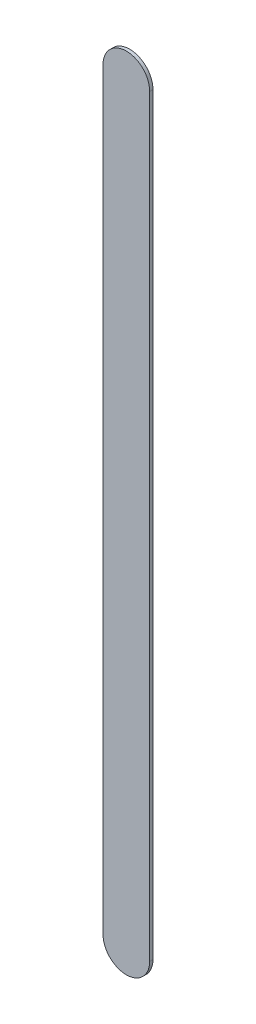
ISO-10303-21;
HEADER;
FILE_DESCRIPTION(('STEP AP214'),'2;1');
FILE_NAME('part.step','',(''),(''),'','','');
FILE_SCHEMA(('AUTOMOTIVE_DESIGN { 1 0 10303 214 1 1 1 1 }'));
ENDSEC;
DATA;
#1=APPLICATION_CONTEXT('core data for automotive mechanical design processes');
#2=APPLICATION_PROTOCOL_DEFINITION('international standard','automotive_design',2000,#1);
#3=PRODUCT_CONTEXT('',#1,'mechanical');
#4=PRODUCT('Part','Part','',(#3));
#5=PRODUCT_RELATED_PRODUCT_CATEGORY('part','',(#4));
#6=PRODUCT_DEFINITION_FORMATION('','',#4);
#7=PRODUCT_DEFINITION_CONTEXT('part definition',#1,'design');
#8=PRODUCT_DEFINITION('design','',#6,#7);
#9=PRODUCT_DEFINITION_SHAPE('','',#8);
#10=(LENGTH_UNIT() NAMED_UNIT(*) SI_UNIT(.MILLI.,.METRE.));
#11=(NAMED_UNIT(*) PLANE_ANGLE_UNIT() SI_UNIT($,.RADIAN.));
#12=(NAMED_UNIT(*) SI_UNIT($,.STERADIAN.) SOLID_ANGLE_UNIT());
#13=UNCERTAINTY_MEASURE_WITH_UNIT(LENGTH_MEASURE(1.E-05),#10,'distance_accuracy_value','');
#14=(GEOMETRIC_REPRESENTATION_CONTEXT(3) GLOBAL_UNCERTAINTY_ASSIGNED_CONTEXT((#13)) GLOBAL_UNIT_ASSIGNED_CONTEXT((#10,
#11,#12)) REPRESENTATION_CONTEXT('',''));
#15=CARTESIAN_POINT('',(0.,0.,0.));
#16=DIRECTION('',(0.,0.,1.));
#17=DIRECTION('',(1.,0.,0.));
#18=AXIS2_PLACEMENT_3D('',#15,#16,#17);
#19=CARTESIAN_POINT('',(131.93,-121.76,1.635));
#20=DIRECTION('',(0.,0.,1.));
#21=DIRECTION('',(1.,0.,0.));
#22=AXIS2_PLACEMENT_3D('',#19,#20,#21);
#23=PLANE('',#22);
#24=DIRECTION('',(0.,-1.,0.));
#25=VECTOR('',#24,1.);
#26=CARTESIAN_POINT('',(131.93,-121.76,1.635));
#27=LINE('',#26,#25);
#28=CARTESIAN_POINT('',(131.93,-121.76,1.635));
#29=VERTEX_POINT('',#28);
#30=CARTESIAN_POINT('',(131.93,-129.84,1.635));
#31=VERTEX_POINT('',#30);
#32=EDGE_CURVE('E74',#29,#31,#27,.T.);
#33=ORIENTED_EDGE('',*,*,#32,.T.);
#34=CARTESIAN_POINT('',(132.18,-129.84,1.635));
#35=DIRECTION('',(0.,0.,1.));
#36=DIRECTION('',(-1.,0.,0.));
#37=AXIS2_PLACEMENT_3D('',#34,#35,#36);
#38=CIRCLE('',#37,0.25);
#39=CARTESIAN_POINT('',(132.43,-129.84,1.635));
#40=VERTEX_POINT('',#39);
#41=EDGE_CURVE('E72',#31,#40,#38,.T.);
#42=ORIENTED_EDGE('',*,*,#41,.T.);
#43=DIRECTION('',(0.,1.,0.));
#44=VECTOR('',#43,1.);
#45=CARTESIAN_POINT('',(132.43,-129.84,1.635));
#46=LINE('',#45,#44);
#47=CARTESIAN_POINT('',(132.43,-121.76,1.635));
#48=VERTEX_POINT('',#47);
#49=EDGE_CURVE('E60',#40,#48,#46,.T.);
#50=ORIENTED_EDGE('',*,*,#49,.T.);
#51=CARTESIAN_POINT('',(132.18,-121.76,1.635));
#52=DIRECTION('',(0.,0.,1.));
#53=DIRECTION('',(1.,0.,0.));
#54=AXIS2_PLACEMENT_3D('',#51,#52,#53);
#55=CIRCLE('',#54,0.25);
#56=EDGE_CURVE('E11',#48,#29,#55,.T.);
#57=ORIENTED_EDGE('',*,*,#56,.T.);
#58=EDGE_LOOP('',(#33,#42,#50,#57));
#59=FACE_BOUND('',#58,.T.);
#60=ADVANCED_FACE('F17',(#59),#23,.T.);
#61=CARTESIAN_POINT('',(131.93,-121.76,1.6));
#62=DIRECTION('',(0.,0.,1.));
#63=DIRECTION('',(1.,0.,0.));
#64=AXIS2_PLACEMENT_3D('',#61,#62,#63);
#65=PLANE('',#64);
#66=CARTESIAN_POINT('',(132.18,-121.76,1.6));
#67=DIRECTION('',(0.,0.,1.));
#68=DIRECTION('',(1.,0.,0.));
#69=AXIS2_PLACEMENT_3D('',#66,#67,#68);
#70=CIRCLE('',#69,0.25);
#71=CARTESIAN_POINT('',(132.43,-121.76,1.6));
#72=VERTEX_POINT('',#71);
#73=CARTESIAN_POINT('',(131.93,-121.76,1.6));
#74=VERTEX_POINT('',#73);
#75=EDGE_CURVE('E26',#72,#74,#70,.T.);
#76=ORIENTED_EDGE('',*,*,#75,.F.);
#77=DIRECTION('',(0.,1.,0.));
#78=VECTOR('',#77,1.);
#79=CARTESIAN_POINT('',(132.43,-129.84,1.6));
#80=LINE('',#79,#78);
#81=CARTESIAN_POINT('',(132.43,-129.84,1.6));
#82=VERTEX_POINT('',#81);
#83=EDGE_CURVE('E79',#82,#72,#80,.T.);
#84=ORIENTED_EDGE('',*,*,#83,.F.);
#85=CARTESIAN_POINT('',(132.18,-129.84,1.6));
#86=DIRECTION('',(0.,0.,1.));
#87=DIRECTION('',(-1.,0.,0.));
#88=AXIS2_PLACEMENT_3D('',#85,#86,#87);
#89=CIRCLE('',#88,0.25);
#90=CARTESIAN_POINT('',(131.93,-129.84,1.6));
#91=VERTEX_POINT('',#90);
#92=EDGE_CURVE('E83',#91,#82,#89,.T.);
#93=ORIENTED_EDGE('',*,*,#92,.F.);
#94=DIRECTION('',(0.,-1.,0.));
#95=VECTOR('',#94,1.);
#96=CARTESIAN_POINT('',(131.93,-121.76,1.6));
#97=LINE('',#96,#95);
#98=EDGE_CURVE('E109',#74,#91,#97,.T.);
#99=ORIENTED_EDGE('',*,*,#98,.F.);
#100=EDGE_LOOP('',(#76,#84,#93,#99));
#101=FACE_BOUND('',#100,.T.);
#102=ADVANCED_FACE('F111',(#101),#65,.F.);
#103=CARTESIAN_POINT('',(132.18,-121.76,1.6));
#104=DIRECTION('',(0.,0.,-1.));
#105=DIRECTION('',(1.,0.,0.));
#106=AXIS2_PLACEMENT_3D('',#103,#104,#105);
#107=CYLINDRICAL_SURFACE('',#106,0.25);
#108=ORIENTED_EDGE('',*,*,#75,.T.);
#109=DIRECTION('',(0.,0.,1.));
#110=VECTOR('',#109,1.);
#111=CARTESIAN_POINT('',(131.93,-121.76,1.6));
#112=LINE('',#111,#110);
#113=EDGE_CURVE('E90',#74,#29,#112,.T.);
#114=ORIENTED_EDGE('',*,*,#113,.T.);
#115=ORIENTED_EDGE('',*,*,#56,.F.);
#116=DIRECTION('',(0.,0.,1.));
#117=VECTOR('',#116,1.);
#118=CARTESIAN_POINT('',(132.43,-121.76,1.6));
#119=LINE('',#118,#117);
#120=EDGE_CURVE('E67',#72,#48,#119,.T.);
#121=ORIENTED_EDGE('',*,*,#120,.F.);
#122=EDGE_LOOP('',(#108,#114,#115,#121));
#123=FACE_BOUND('',#122,.T.);
#124=ADVANCED_FACE('F102',(#123),#107,.T.);
#125=CARTESIAN_POINT('',(132.43,-129.84,1.6));
#126=DIRECTION('',(-1.,0.,0.));
#127=DIRECTION('',(0.,0.,1.));
#128=AXIS2_PLACEMENT_3D('',#125,#126,#127);
#129=PLANE('',#128);
#130=ORIENTED_EDGE('',*,*,#83,.T.);
#131=ORIENTED_EDGE('',*,*,#120,.T.);
#132=ORIENTED_EDGE('',*,*,#49,.F.);
#133=DIRECTION('',(0.,0.,1.));
#134=VECTOR('',#133,1.);
#135=CARTESIAN_POINT('',(132.43,-129.84,1.6));
#136=LINE('',#135,#134);
#137=EDGE_CURVE('E65',#82,#40,#136,.T.);
#138=ORIENTED_EDGE('',*,*,#137,.F.);
#139=EDGE_LOOP('',(#130,#131,#132,#138));
#140=FACE_BOUND('',#139,.T.);
#141=ADVANCED_FACE('F63',(#140),#129,.F.);
#142=CARTESIAN_POINT('',(132.18,-129.84,1.6));
#143=DIRECTION('',(0.,0.,-1.));
#144=DIRECTION('',(-1.,0.,0.));
#145=AXIS2_PLACEMENT_3D('',#142,#143,#144);
#146=CYLINDRICAL_SURFACE('',#145,0.25);
#147=ORIENTED_EDGE('',*,*,#92,.T.);
#148=ORIENTED_EDGE('',*,*,#137,.T.);
#149=ORIENTED_EDGE('',*,*,#41,.F.);
#150=DIRECTION('',(0.,0.,1.));
#151=VECTOR('',#150,1.);
#152=CARTESIAN_POINT('',(131.93,-129.84,1.6));
#153=LINE('',#152,#151);
#154=EDGE_CURVE('E113',#91,#31,#153,.T.);
#155=ORIENTED_EDGE('',*,*,#154,.F.);
#156=EDGE_LOOP('',(#147,#148,#149,#155));
#157=FACE_BOUND('',#156,.T.);
#158=ADVANCED_FACE('F81',(#157),#146,.T.);
#159=CARTESIAN_POINT('',(131.93,-121.76,1.6));
#160=DIRECTION('',(1.,0.,0.));
#161=DIRECTION('',(0.,1.,0.));
#162=AXIS2_PLACEMENT_3D('',#159,#160,#161);
#163=PLANE('',#162);
#164=ORIENTED_EDGE('',*,*,#98,.T.);
#165=ORIENTED_EDGE('',*,*,#154,.T.);
#166=ORIENTED_EDGE('',*,*,#32,.F.);
#167=ORIENTED_EDGE('',*,*,#113,.F.);
#168=EDGE_LOOP('',(#164,#165,#166,#167));
#169=FACE_BOUND('',#168,.T.);
#170=ADVANCED_FACE('F108',(#169),#163,.F.);
#171=CLOSED_SHELL('',(#60,#102,#124,#141,#158,#170));
#172=MANIFOLD_SOLID_BREP('B1',#171);
#173=ADVANCED_BREP_SHAPE_REPRESENTATION('',(#18,#172),#14);
#174=SHAPE_DEFINITION_REPRESENTATION(#9,#173);
ENDSEC;
END-ISO-10303-21;
